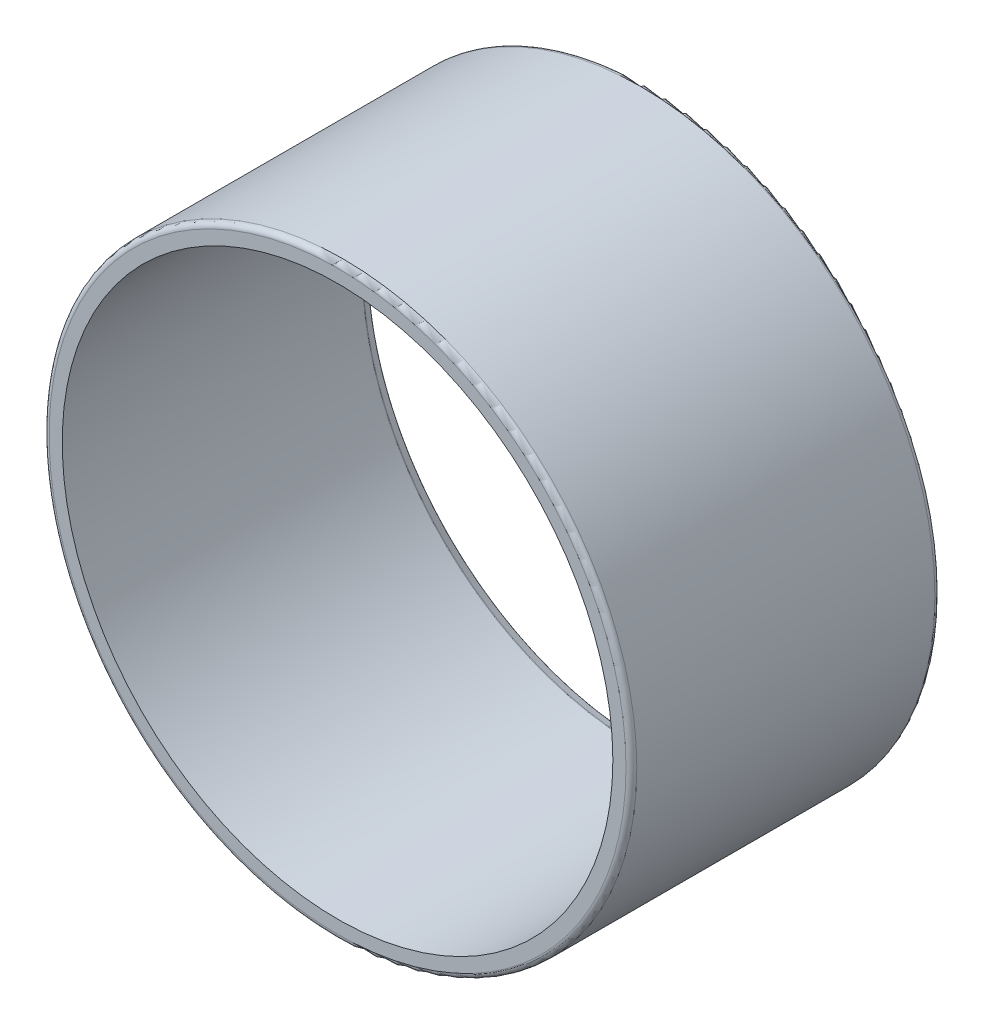
ISO-10303-21;
HEADER;
FILE_DESCRIPTION(('STEP AP214'),'2;1');
FILE_NAME('part.step','',(''),(''),'','','');
FILE_SCHEMA(('AUTOMOTIVE_DESIGN { 1 0 10303 214 1 1 1 1 }'));
ENDSEC;
DATA;
#1=APPLICATION_CONTEXT('core data for automotive mechanical design processes');
#2=APPLICATION_PROTOCOL_DEFINITION('international standard','automotive_design',2000,#1);
#3=PRODUCT_CONTEXT('',#1,'mechanical');
#4=PRODUCT('Part','Part','',(#3));
#5=PRODUCT_RELATED_PRODUCT_CATEGORY('part','',(#4));
#6=PRODUCT_DEFINITION_FORMATION('','',#4);
#7=PRODUCT_DEFINITION_CONTEXT('part definition',#1,'design');
#8=PRODUCT_DEFINITION('design','',#6,#7);
#9=PRODUCT_DEFINITION_SHAPE('','',#8);
#10=(LENGTH_UNIT() NAMED_UNIT(*) SI_UNIT(.MILLI.,.METRE.));
#11=(NAMED_UNIT(*) PLANE_ANGLE_UNIT() SI_UNIT($,.RADIAN.));
#12=(NAMED_UNIT(*) SI_UNIT($,.STERADIAN.) SOLID_ANGLE_UNIT());
#13=UNCERTAINTY_MEASURE_WITH_UNIT(LENGTH_MEASURE(1.E-05),#10,'distance_accuracy_value','');
#14=(GEOMETRIC_REPRESENTATION_CONTEXT(3) GLOBAL_UNCERTAINTY_ASSIGNED_CONTEXT((#13)) GLOBAL_UNIT_ASSIGNED_CONTEXT((#10,
#11,#12)) REPRESENTATION_CONTEXT('',''));
#15=CARTESIAN_POINT('',(0.,0.,0.));
#16=DIRECTION('',(0.,0.,1.));
#17=DIRECTION('',(1.,0.,0.));
#18=AXIS2_PLACEMENT_3D('',#15,#16,#17);
#19=CARTESIAN_POINT('',(0.,0.,-10.));
#20=DIRECTION('',(0.,0.,1.));
#21=DIRECTION('',(1.,0.,0.));
#22=AXIS2_PLACEMENT_3D('',#19,#20,#21);
#23=PLANE('',#22);
#24=CARTESIAN_POINT('',(0.,0.,-10.));
#25=DIRECTION('',(0.,0.,1.));
#26=DIRECTION('',(1.,0.,0.));
#27=AXIS2_PLACEMENT_3D('',#24,#25,#26);
#28=CIRCLE('',#27,18.0600103769105);
#29=CARTESIAN_POINT('',(18.0600103769105,0.,-10.));
#30=VERTEX_POINT('',#29);
#31=EDGE_CURVE('E11',#30,#30,#28,.T.);
#32=ORIENTED_EDGE('',*,*,#31,.T.);
#33=EDGE_LOOP('',(#32));
#34=FACE_BOUND('',#33,.T.);
#35=CARTESIAN_POINT('',(0.,0.,-10.));
#36=DIRECTION('',(0.,0.,1.));
#37=DIRECTION('',(1.,0.,0.));
#38=AXIS2_PLACEMENT_3D('',#35,#36,#37);
#39=CIRCLE('',#38,18.675);
#40=CARTESIAN_POINT('',(18.675,0.,-10.));
#41=VERTEX_POINT('',#40);
#42=EDGE_CURVE('E71',#41,#41,#39,.T.);
#43=ORIENTED_EDGE('',*,*,#42,.F.);
#44=EDGE_LOOP('',(#43));
#45=FACE_BOUND('',#44,.T.);
#46=ADVANCED_FACE('F47',(#34,#45),#23,.F.);
#47=CARTESIAN_POINT('',(0.,0.,-9.65));
#48=DIRECTION('',(0.,0.,1.));
#49=DIRECTION('',(1.,0.,0.));
#50=AXIS2_PLACEMENT_3D('',#47,#48,#49);
#51=TOROIDAL_SURFACE('',#50,18.675,0.35);
#52=CARTESIAN_POINT('',(0.,0.,-9.65));
#53=DIRECTION('',(0.,0.,1.));
#54=DIRECTION('',(1.,0.,0.));
#55=AXIS2_PLACEMENT_3D('',#52,#53,#54);
#56=CIRCLE('',#55,19.025);
#57=CARTESIAN_POINT('',(19.025,0.,-9.65));
#58=VERTEX_POINT('',#57);
#59=EDGE_CURVE('E75',#58,#58,#56,.T.);
#60=ORIENTED_EDGE('',*,*,#59,.F.);
#61=EDGE_LOOP('',(#60));
#62=FACE_BOUND('',#61,.T.);
#63=ORIENTED_EDGE('',*,*,#42,.T.);
#64=EDGE_LOOP('',(#63));
#65=FACE_BOUND('',#64,.T.);
#66=ADVANCED_FACE('F109',(#62,#65),#51,.T.);
#67=CARTESIAN_POINT('',(0.,0.,11.7044233271983));
#68=DIRECTION('',(0.,0.,1.));
#69=DIRECTION('',(1.,0.,0.));
#70=AXIS2_PLACEMENT_3D('',#67,#68,#69);
#71=CYLINDRICAL_SURFACE('',#70,19.025);
#72=CARTESIAN_POINT('',(0.,0.,9.65));
#73=DIRECTION('',(0.,0.,1.));
#74=DIRECTION('',(1.,0.,0.));
#75=AXIS2_PLACEMENT_3D('',#72,#73,#74);
#76=CIRCLE('',#75,19.025);
#77=CARTESIAN_POINT('',(19.025,0.,9.65));
#78=VERTEX_POINT('',#77);
#79=EDGE_CURVE('E79',#78,#78,#76,.T.);
#80=ORIENTED_EDGE('',*,*,#79,.F.);
#81=EDGE_LOOP('',(#80));
#82=FACE_BOUND('',#81,.T.);
#83=ORIENTED_EDGE('',*,*,#59,.T.);
#84=EDGE_LOOP('',(#83));
#85=FACE_BOUND('',#84,.T.);
#86=ADVANCED_FACE('F103',(#82,#85),#71,.T.);
#87=CARTESIAN_POINT('',(0.,0.,9.65));
#88=DIRECTION('',(0.,0.,1.));
#89=DIRECTION('',(1.,0.,0.));
#90=AXIS2_PLACEMENT_3D('',#87,#88,#89);
#91=TOROIDAL_SURFACE('',#90,18.675,0.349999999999996);
#92=CARTESIAN_POINT('',(0.,0.,10.));
#93=DIRECTION('',(0.,0.,1.));
#94=DIRECTION('',(1.,0.,0.));
#95=AXIS2_PLACEMENT_3D('',#92,#93,#94);
#96=CIRCLE('',#95,18.675);
#97=CARTESIAN_POINT('',(18.675,0.,10.));
#98=VERTEX_POINT('',#97);
#99=EDGE_CURVE('E83',#98,#98,#96,.T.);
#100=ORIENTED_EDGE('',*,*,#99,.F.);
#101=EDGE_LOOP('',(#100));
#102=FACE_BOUND('',#101,.T.);
#103=ORIENTED_EDGE('',*,*,#79,.T.);
#104=EDGE_LOOP('',(#103));
#105=FACE_BOUND('',#104,.T.);
#106=ADVANCED_FACE('F97',(#102,#105),#91,.T.);
#107=CARTESIAN_POINT('',(0.,0.,10.));
#108=DIRECTION('',(0.,0.,-1.));
#109=DIRECTION('',(-1.,0.,0.));
#110=AXIS2_PLACEMENT_3D('',#107,#108,#109);
#111=PLANE('',#110);
#112=CARTESIAN_POINT('',(0.,0.,10.));
#113=DIRECTION('',(0.,0.,1.));
#114=DIRECTION('',(1.,0.,0.));
#115=AXIS2_PLACEMENT_3D('',#112,#113,#114);
#116=CIRCLE('',#115,17.825);
#117=CARTESIAN_POINT('',(17.825,0.,10.));
#118=VERTEX_POINT('',#117);
#119=EDGE_CURVE('E87',#118,#118,#116,.T.);
#120=ORIENTED_EDGE('',*,*,#119,.F.);
#121=EDGE_LOOP('',(#120));
#122=FACE_BOUND('',#121,.T.);
#123=ORIENTED_EDGE('',*,*,#99,.T.);
#124=EDGE_LOOP('',(#123));
#125=FACE_BOUND('',#124,.T.);
#126=ADVANCED_FACE('F94',(#122,#125),#111,.F.);
#127=CARTESIAN_POINT('',(0.,0.,11.7044233271983));
#128=DIRECTION('',(0.,0.,1.));
#129=DIRECTION('',(1.,0.,0.));
#130=AXIS2_PLACEMENT_3D('',#127,#128,#129);
#131=CYLINDRICAL_SURFACE('',#130,17.825);
#132=CARTESIAN_POINT('',(0.,0.,-9.42405546900282));
#133=DIRECTION('',(0.,0.,-1.));
#134=DIRECTION('',(-1.,0.,0.));
#135=AXIS2_PLACEMENT_3D('',#132,#133,#134);
#136=CIRCLE('',#135,17.825);
#137=CARTESIAN_POINT('',(-17.825,0.,-9.42405546900282));
#138=VERTEX_POINT('',#137);
#139=EDGE_CURVE('E55',#138,#138,#136,.T.);
#140=ORIENTED_EDGE('',*,*,#139,.T.);
#141=EDGE_LOOP('',(#140));
#142=FACE_BOUND('',#141,.T.);
#143=ORIENTED_EDGE('',*,*,#119,.T.);
#144=EDGE_LOOP('',(#143));
#145=FACE_BOUND('',#144,.T.);
#146=ADVANCED_FACE('F92',(#142,#145),#131,.F.);
#147=CARTESIAN_POINT('',(0.,0.,-9.45050451610908));
#148=DIRECTION('',(0.,0.,-1.));
#149=DIRECTION('',(-1.,0.,0.));
#150=AXIS2_PLACEMENT_3D('',#147,#148,#149);
#151=CONICAL_SURFACE('',#150,17.825,0.349065850398864);
#152=CARTESIAN_POINT('',(0.,0.,-9.47535849050167));
#153=DIRECTION('',(0.,0.,1.));
#154=DIRECTION('',(1.,0.,0.));
#155=AXIS2_PLACEMENT_3D('',#152,#153,#154);
#156=CIRCLE('',#155,17.8340461068821);
#157=CARTESIAN_POINT('',(17.8340461068821,0.,-9.47535849050167));
#158=VERTEX_POINT('',#157);
#159=EDGE_CURVE('E60',#158,#158,#156,.T.);
#160=ORIENTED_EDGE('',*,*,#159,.T.);
#161=EDGE_LOOP('',(#160));
#162=FACE_BOUND('',#161,.T.);
#163=CARTESIAN_POINT('',(0.,0.,-9.96710100716629));
#164=DIRECTION('',(0.,0.,1.));
#165=DIRECTION('',(1.,0.,0.));
#166=AXIS2_PLACEMENT_3D('',#163,#164,#165);
#167=CIRCLE('',#166,18.0130257458712);
#168=CARTESIAN_POINT('',(18.0130257458712,0.,-9.96710100716629));
#169=VERTEX_POINT('',#168);
#170=EDGE_CURVE('E65',#169,#169,#167,.F.);
#171=ORIENTED_EDGE('',*,*,#170,.T.);
#172=EDGE_LOOP('',(#171));
#173=FACE_BOUND('',#172,.T.);
#174=ADVANCED_FACE('F125',(#162,#173),#151,.F.);
#175=CARTESIAN_POINT('',(0.,0.,-9.42405546900282));
#176=DIRECTION('',(0.,0.,-1.));
#177=DIRECTION('',(-1.,0.,0.));
#178=AXIS2_PLACEMENT_3D('',#175,#176,#177);
#179=TOROIDAL_SURFACE('',#178,17.975,0.15);
#180=ORIENTED_EDGE('',*,*,#139,.F.);
#181=EDGE_LOOP('',(#180));
#182=FACE_BOUND('',#181,.T.);
#183=ORIENTED_EDGE('',*,*,#159,.F.);
#184=EDGE_LOOP('',(#183));
#185=FACE_BOUND('',#184,.T.);
#186=ADVANCED_FACE('F123',(#182,#185),#179,.T.);
#187=CARTESIAN_POINT('',(0.,0.,-9.95));
#188=DIRECTION('',(0.,0.,1.));
#189=DIRECTION('',(1.,0.,0.));
#190=AXIS2_PLACEMENT_3D('',#187,#188,#189);
#191=TOROIDAL_SURFACE('',#190,18.0600103769105,0.05);
#192=ORIENTED_EDGE('',*,*,#170,.F.);
#193=EDGE_LOOP('',(#192));
#194=FACE_BOUND('',#193,.T.);
#195=ORIENTED_EDGE('',*,*,#31,.F.);
#196=EDGE_LOOP('',(#195));
#197=FACE_BOUND('',#196,.T.);
#198=ADVANCED_FACE('F49',(#194,#197),#191,.T.);
#199=CLOSED_SHELL('',(#46,#66,#86,#106,#126,#146,#174,#186,#198));
#200=MANIFOLD_SOLID_BREP('B2',#199);
#201=ADVANCED_BREP_SHAPE_REPRESENTATION('',(#18,#200),#14);
#202=SHAPE_DEFINITION_REPRESENTATION(#9,#201);
ENDSEC;
END-ISO-10303-21;
